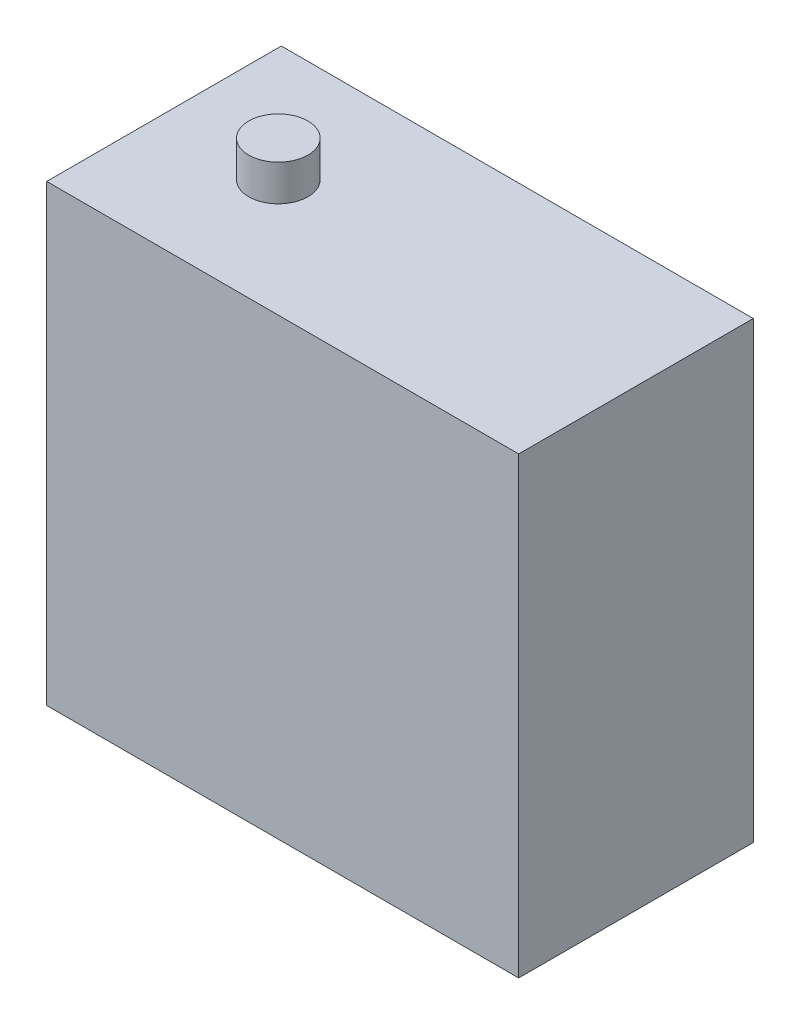
ISO-10303-21;
HEADER;
FILE_DESCRIPTION(('STEP AP214'),'2;1');
FILE_NAME('part.step','',(''),(''),'','','');
FILE_SCHEMA(('AUTOMOTIVE_DESIGN { 1 0 10303 214 1 1 1 1 }'));
ENDSEC;
DATA;
#1=APPLICATION_CONTEXT('core data for automotive mechanical design processes');
#2=APPLICATION_PROTOCOL_DEFINITION('international standard','automotive_design',2000,#1);
#3=PRODUCT_CONTEXT('',#1,'mechanical');
#4=PRODUCT('Part','Part','',(#3));
#5=PRODUCT_RELATED_PRODUCT_CATEGORY('part','',(#4));
#6=PRODUCT_DEFINITION_FORMATION('','',#4);
#7=PRODUCT_DEFINITION_CONTEXT('part definition',#1,'design');
#8=PRODUCT_DEFINITION('design','',#6,#7);
#9=PRODUCT_DEFINITION_SHAPE('','',#8);
#10=(LENGTH_UNIT() NAMED_UNIT(*) SI_UNIT(.MILLI.,.METRE.));
#11=(NAMED_UNIT(*) PLANE_ANGLE_UNIT() SI_UNIT($,.RADIAN.));
#12=(NAMED_UNIT(*) SI_UNIT($,.STERADIAN.) SOLID_ANGLE_UNIT());
#13=UNCERTAINTY_MEASURE_WITH_UNIT(LENGTH_MEASURE(1.E-05),#10,'distance_accuracy_value','');
#14=(GEOMETRIC_REPRESENTATION_CONTEXT(3) GLOBAL_UNCERTAINTY_ASSIGNED_CONTEXT((#13)) GLOBAL_UNIT_ASSIGNED_CONTEXT((#10,
#11,#12)) REPRESENTATION_CONTEXT('',''));
#15=CARTESIAN_POINT('',(0.,0.,0.));
#16=DIRECTION('',(0.,0.,1.));
#17=DIRECTION('',(1.,0.,0.));
#18=AXIS2_PLACEMENT_3D('',#15,#16,#17);
#19=CARTESIAN_POINT('',(0.,38.35,0.));
#20=DIRECTION('',(1.,0.,0.));
#21=DIRECTION('',(0.,0.,-1.));
#22=AXIS2_PLACEMENT_3D('',#19,#20,#21);
#23=PLANE('',#22);
#24=DIRECTION('',(0.,0.,1.));
#25=VECTOR('',#24,1.);
#26=CARTESIAN_POINT('',(0.,0.,0.));
#27=LINE('',#26,#25);
#28=CARTESIAN_POINT('',(0.,0.,-19.82));
#29=VERTEX_POINT('',#28);
#30=CARTESIAN_POINT('',(0.,0.,0.));
#31=VERTEX_POINT('',#30);
#32=EDGE_CURVE('E98',#29,#31,#27,.T.);
#33=ORIENTED_EDGE('',*,*,#32,.T.);
#34=DIRECTION('',(0.,-1.,0.));
#35=VECTOR('',#34,1.);
#36=CARTESIAN_POINT('',(0.,38.35,0.));
#37=LINE('',#36,#35);
#38=CARTESIAN_POINT('',(0.,38.35,0.));
#39=VERTEX_POINT('',#38);
#40=EDGE_CURVE('E40',#39,#31,#37,.T.);
#41=ORIENTED_EDGE('',*,*,#40,.F.);
#42=DIRECTION('',(0.,0.,1.));
#43=VECTOR('',#42,1.);
#44=CARTESIAN_POINT('',(0.,38.35,0.));
#45=LINE('',#44,#43);
#46=CARTESIAN_POINT('',(0.,38.35,-19.82));
#47=VERTEX_POINT('',#46);
#48=EDGE_CURVE('E84',#47,#39,#45,.T.);
#49=ORIENTED_EDGE('',*,*,#48,.F.);
#50=DIRECTION('',(0.,-1.,0.));
#51=VECTOR('',#50,1.);
#52=CARTESIAN_POINT('',(0.,38.35,-19.82));
#53=LINE('',#52,#51);
#54=EDGE_CURVE('E94',#47,#29,#53,.T.);
#55=ORIENTED_EDGE('',*,*,#54,.T.);
#56=EDGE_LOOP('',(#33,#41,#49,#55));
#57=FACE_BOUND('',#56,.T.);
#58=ADVANCED_FACE('F32',(#57),#23,.F.);
#59=CARTESIAN_POINT('',(0.,38.35,0.));
#60=DIRECTION('',(0.,0.,-1.));
#61=DIRECTION('',(-1.,0.,0.));
#62=AXIS2_PLACEMENT_3D('',#59,#60,#61);
#63=PLANE('',#62);
#64=DIRECTION('',(1.,0.,0.));
#65=VECTOR('',#64,1.);
#66=CARTESIAN_POINT('',(0.,0.,0.));
#67=LINE('',#66,#65);
#68=CARTESIAN_POINT('',(39.88,0.,0.));
#69=VERTEX_POINT('',#68);
#70=EDGE_CURVE('E89',#31,#69,#67,.T.);
#71=ORIENTED_EDGE('',*,*,#70,.T.);
#72=DIRECTION('',(0.,-1.,0.));
#73=VECTOR('',#72,1.);
#74=CARTESIAN_POINT('',(39.88,38.35,0.));
#75=LINE('',#74,#73);
#76=CARTESIAN_POINT('',(39.88,38.35,0.));
#77=VERTEX_POINT('',#76);
#78=EDGE_CURVE('E87',#77,#69,#75,.T.);
#79=ORIENTED_EDGE('',*,*,#78,.F.);
#80=DIRECTION('',(1.,0.,0.));
#81=VECTOR('',#80,1.);
#82=CARTESIAN_POINT('',(0.,38.35,0.));
#83=LINE('',#82,#81);
#84=EDGE_CURVE('E79',#39,#77,#83,.T.);
#85=ORIENTED_EDGE('',*,*,#84,.F.);
#86=ORIENTED_EDGE('',*,*,#40,.T.);
#87=EDGE_LOOP('',(#71,#79,#85,#86));
#88=FACE_BOUND('',#87,.T.);
#89=ADVANCED_FACE('F88',(#88),#63,.F.);
#90=CARTESIAN_POINT('',(39.88,38.35,0.));
#91=DIRECTION('',(-1.,0.,0.));
#92=DIRECTION('',(0.,0.,1.));
#93=AXIS2_PLACEMENT_3D('',#90,#91,#92);
#94=PLANE('',#93);
#95=DIRECTION('',(0.,0.,-1.));
#96=VECTOR('',#95,1.);
#97=CARTESIAN_POINT('',(39.88,0.,0.));
#98=LINE('',#97,#96);
#99=CARTESIAN_POINT('',(39.88,0.,-19.82));
#100=VERTEX_POINT('',#99);
#101=EDGE_CURVE('E65',#69,#100,#98,.T.);
#102=ORIENTED_EDGE('',*,*,#101,.T.);
#103=DIRECTION('',(0.,-1.,0.));
#104=VECTOR('',#103,1.);
#105=CARTESIAN_POINT('',(39.88,38.35,-19.82));
#106=LINE('',#105,#104);
#107=CARTESIAN_POINT('',(39.88,38.35,-19.82));
#108=VERTEX_POINT('',#107);
#109=EDGE_CURVE('E90',#108,#100,#106,.T.);
#110=ORIENTED_EDGE('',*,*,#109,.F.);
#111=DIRECTION('',(0.,0.,-1.));
#112=VECTOR('',#111,1.);
#113=CARTESIAN_POINT('',(39.88,38.35,0.));
#114=LINE('',#113,#112);
#115=EDGE_CURVE('E82',#77,#108,#114,.T.);
#116=ORIENTED_EDGE('',*,*,#115,.F.);
#117=ORIENTED_EDGE('',*,*,#78,.T.);
#118=EDGE_LOOP('',(#102,#110,#116,#117));
#119=FACE_BOUND('',#118,.T.);
#120=ADVANCED_FACE('F92',(#119),#94,.F.);
#121=CARTESIAN_POINT('',(0.,38.35,-19.82));
#122=DIRECTION('',(0.,0.,1.));
#123=DIRECTION('',(1.,0.,0.));
#124=AXIS2_PLACEMENT_3D('',#121,#122,#123);
#125=PLANE('',#124);
#126=DIRECTION('',(-1.,0.,0.));
#127=VECTOR('',#126,1.);
#128=CARTESIAN_POINT('',(0.,0.,-19.82));
#129=LINE('',#128,#127);
#130=EDGE_CURVE('E71',#100,#29,#129,.T.);
#131=ORIENTED_EDGE('',*,*,#130,.T.);
#132=ORIENTED_EDGE('',*,*,#54,.F.);
#133=DIRECTION('',(-1.,0.,0.));
#134=VECTOR('',#133,1.);
#135=CARTESIAN_POINT('',(0.,38.35,-19.82));
#136=LINE('',#135,#134);
#137=EDGE_CURVE('E48',#108,#47,#136,.T.);
#138=ORIENTED_EDGE('',*,*,#137,.F.);
#139=ORIENTED_EDGE('',*,*,#109,.T.);
#140=EDGE_LOOP('',(#131,#132,#138,#139));
#141=FACE_BOUND('',#140,.T.);
#142=ADVANCED_FACE('F120',(#141),#125,.F.);
#143=CARTESIAN_POINT('',(0.,38.35,0.));
#144=DIRECTION('',(0.,-1.,0.));
#145=DIRECTION('',(0.,0.,-1.));
#146=AXIS2_PLACEMENT_3D('',#143,#144,#145);
#147=PLANE('',#146);
#148=CARTESIAN_POINT('',(9.66,38.35,-9.91));
#149=DIRECTION('',(0.,-1.,0.));
#150=DIRECTION('',(0.,0.,-1.));
#151=AXIS2_PLACEMENT_3D('',#148,#149,#150);
#152=CIRCLE('',#151,2.5);
#153=CARTESIAN_POINT('',(9.66,38.35,-12.41));
#154=VERTEX_POINT('',#153);
#155=EDGE_CURVE('E11',#154,#154,#152,.F.);
#156=ORIENTED_EDGE('',*,*,#155,.F.);
#157=EDGE_LOOP('',(#156));
#158=FACE_BOUND('',#157,.T.);
#159=ORIENTED_EDGE('',*,*,#48,.T.);
#160=ORIENTED_EDGE('',*,*,#84,.T.);
#161=ORIENTED_EDGE('',*,*,#115,.T.);
#162=ORIENTED_EDGE('',*,*,#137,.T.);
#163=EDGE_LOOP('',(#159,#160,#161,#162));
#164=FACE_BOUND('',#163,.T.);
#165=ADVANCED_FACE('F80',(#158,#164),#147,.F.);
#166=CARTESIAN_POINT('',(0.,0.,0.));
#167=DIRECTION('',(0.,-1.,0.));
#168=DIRECTION('',(0.,0.,-1.));
#169=AXIS2_PLACEMENT_3D('',#166,#167,#168);
#170=PLANE('',#169);
#171=ORIENTED_EDGE('',*,*,#32,.F.);
#172=ORIENTED_EDGE('',*,*,#130,.F.);
#173=ORIENTED_EDGE('',*,*,#101,.F.);
#174=ORIENTED_EDGE('',*,*,#70,.F.);
#175=EDGE_LOOP('',(#171,#172,#173,#174));
#176=FACE_BOUND('',#175,.T.);
#177=ADVANCED_FACE('F109',(#176),#170,.T.);
#178=CARTESIAN_POINT('',(9.66,41.4,-9.91));
#179=DIRECTION('',(0.,-1.,0.));
#180=DIRECTION('',(0.,0.,-1.));
#181=AXIS2_PLACEMENT_3D('',#178,#179,#180);
#182=CYLINDRICAL_SURFACE('',#181,2.5);
#183=CARTESIAN_POINT('',(9.66,41.4,-9.91));
#184=DIRECTION('',(0.,1.,0.));
#185=DIRECTION('',(0.,0.,1.));
#186=AXIS2_PLACEMENT_3D('',#183,#184,#185);
#187=CIRCLE('',#186,2.5);
#188=CARTESIAN_POINT('',(9.66,41.4,-7.41));
#189=VERTEX_POINT('',#188);
#190=EDGE_CURVE('E101',#189,#189,#187,.T.);
#191=ORIENTED_EDGE('',*,*,#190,.F.);
#192=EDGE_LOOP('',(#191));
#193=FACE_BOUND('',#192,.T.);
#194=ORIENTED_EDGE('',*,*,#155,.T.);
#195=EDGE_LOOP('',(#194));
#196=FACE_BOUND('',#195,.T.);
#197=ADVANCED_FACE('F111',(#193,#196),#182,.T.);
#198=CARTESIAN_POINT('',(9.66,41.4,-9.91));
#199=DIRECTION('',(0.,1.,0.));
#200=DIRECTION('',(0.,0.,1.));
#201=AXIS2_PLACEMENT_3D('',#198,#199,#200);
#202=PLANE('',#201);
#203=ORIENTED_EDGE('',*,*,#190,.T.);
#204=EDGE_LOOP('',(#203));
#205=FACE_BOUND('',#204,.T.);
#206=ADVANCED_FACE('F117',(#205),#202,.T.);
#207=CLOSED_SHELL('',(#58,#89,#120,#142,#165,#177,#197,#206));
#208=MANIFOLD_SOLID_BREP('B2',#207);
#209=ADVANCED_BREP_SHAPE_REPRESENTATION('',(#18,#208),#14);
#210=SHAPE_DEFINITION_REPRESENTATION(#9,#209);
ENDSEC;
END-ISO-10303-21;
